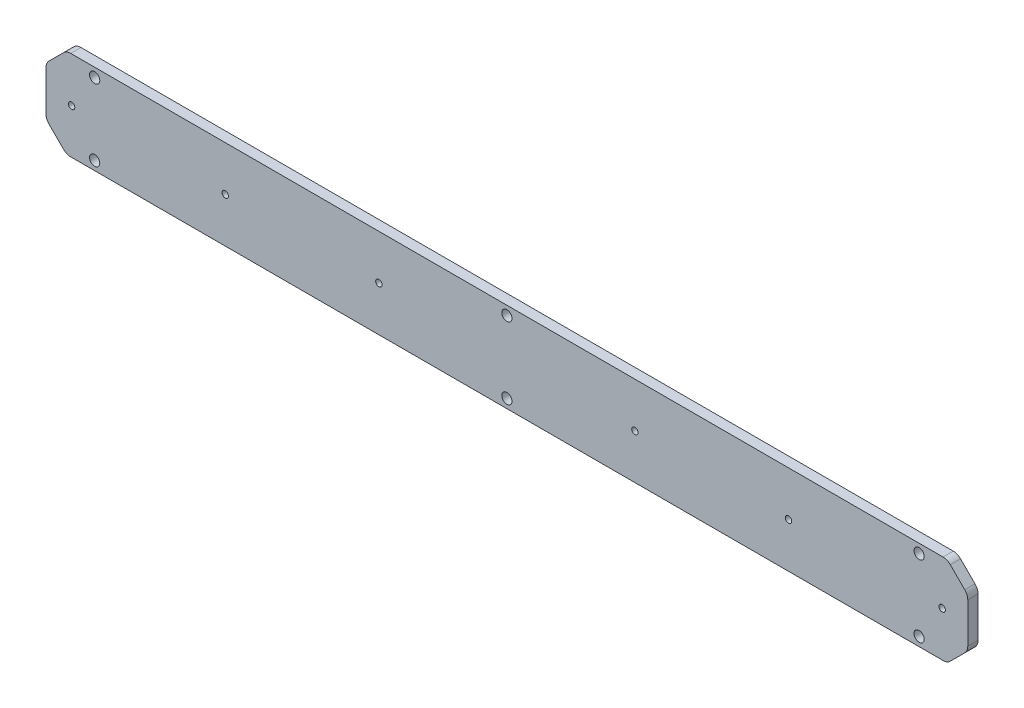
ISO-10303-21;
HEADER;
FILE_DESCRIPTION(('STEP AP214'),'2;1');
FILE_NAME('part.step','',(''),(''),'','','');
FILE_SCHEMA(('AUTOMOTIVE_DESIGN { 1 0 10303 214 1 1 1 1 }'));
ENDSEC;
DATA;
#1=APPLICATION_CONTEXT('core data for automotive mechanical design processes');
#2=APPLICATION_PROTOCOL_DEFINITION('international standard','automotive_design',2000,#1);
#3=PRODUCT_CONTEXT('',#1,'mechanical');
#4=PRODUCT('Part','Part','',(#3));
#5=PRODUCT_RELATED_PRODUCT_CATEGORY('part','',(#4));
#6=PRODUCT_DEFINITION_FORMATION('','',#4);
#7=PRODUCT_DEFINITION_CONTEXT('part definition',#1,'design');
#8=PRODUCT_DEFINITION('design','',#6,#7);
#9=PRODUCT_DEFINITION_SHAPE('','',#8);
#10=(LENGTH_UNIT() NAMED_UNIT(*) SI_UNIT(.MILLI.,.METRE.));
#11=(NAMED_UNIT(*) PLANE_ANGLE_UNIT() SI_UNIT($,.RADIAN.));
#12=(NAMED_UNIT(*) SI_UNIT($,.STERADIAN.) SOLID_ANGLE_UNIT());
#13=UNCERTAINTY_MEASURE_WITH_UNIT(LENGTH_MEASURE(1.E-05),#10,'distance_accuracy_value','');
#14=(GEOMETRIC_REPRESENTATION_CONTEXT(3) GLOBAL_UNCERTAINTY_ASSIGNED_CONTEXT((#13)) GLOBAL_UNIT_ASSIGNED_CONTEXT((#10,
#11,#12)) REPRESENTATION_CONTEXT('',''));
#15=CARTESIAN_POINT('',(0.,0.,0.));
#16=DIRECTION('',(0.,0.,1.));
#17=DIRECTION('',(1.,0.,0.));
#18=AXIS2_PLACEMENT_3D('',#15,#16,#17);
#19=CARTESIAN_POINT('',(180.,-17.5,4.));
#20=DIRECTION('',(-1.,0.,0.));
#21=DIRECTION('',(0.,0.,1.));
#22=AXIS2_PLACEMENT_3D('',#19,#20,#21);
#23=PLANE('',#22);
#24=DIRECTION('',(0.,1.,0.));
#25=VECTOR('',#24,1.);
#26=CARTESIAN_POINT('',(180.,-17.5,4.));
#27=LINE('',#26,#25);
#28=CARTESIAN_POINT('',(180.,-7.84314575050758,4.));
#29=VERTEX_POINT('',#28);
#30=CARTESIAN_POINT('',(180.,7.84314575050757,4.));
#31=VERTEX_POINT('',#30);
#32=EDGE_CURVE('E180',#29,#31,#27,.T.);
#33=ORIENTED_EDGE('',*,*,#32,.F.);
#34=DIRECTION('',(0.,0.,1.));
#35=VECTOR('',#34,1.);
#36=CARTESIAN_POINT('',(180.,-7.84314575050758,0.));
#37=LINE('',#36,#35);
#38=CARTESIAN_POINT('',(180.,-7.84314575050758,0.));
#39=VERTEX_POINT('',#38);
#40=EDGE_CURVE('E287',#29,#39,#37,.F.);
#41=ORIENTED_EDGE('',*,*,#40,.T.);
#42=DIRECTION('',(0.,1.,0.));
#43=VECTOR('',#42,1.);
#44=CARTESIAN_POINT('',(180.,-17.5,0.));
#45=LINE('',#44,#43);
#46=CARTESIAN_POINT('',(180.,7.84314575050757,0.));
#47=VERTEX_POINT('',#46);
#48=EDGE_CURVE('E194',#39,#47,#45,.T.);
#49=ORIENTED_EDGE('',*,*,#48,.T.);
#50=DIRECTION('',(0.,0.,-1.));
#51=VECTOR('',#50,1.);
#52=CARTESIAN_POINT('',(180.,7.84314575050757,4.));
#53=LINE('',#52,#51);
#54=EDGE_CURVE('E284',#47,#31,#53,.F.);
#55=ORIENTED_EDGE('',*,*,#54,.T.);
#56=EDGE_LOOP('',(#33,#41,#49,#55));
#57=FACE_BOUND('',#56,.T.);
#58=ADVANCED_FACE('F36',(#57),#23,.F.);
#59=CARTESIAN_POINT('',(-180.,17.5,4.));
#60=DIRECTION('',(0.,-1.,0.));
#61=DIRECTION('',(0.,0.,-1.));
#62=AXIS2_PLACEMENT_3D('',#59,#60,#61);
#63=PLANE('',#62);
#64=DIRECTION('',(-1.,0.,0.));
#65=VECTOR('',#64,1.);
#66=CARTESIAN_POINT('',(-180.,17.5,0.));
#67=LINE('',#66,#65);
#68=CARTESIAN_POINT('',(170.343145750507,17.5,0.));
#69=VERTEX_POINT('',#68);
#70=CARTESIAN_POINT('',(-170.343145750508,17.5,0.));
#71=VERTEX_POINT('',#70);
#72=EDGE_CURVE('E187',#69,#71,#67,.T.);
#73=ORIENTED_EDGE('',*,*,#72,.T.);
#74=DIRECTION('',(0.,0.,-1.));
#75=VECTOR('',#74,1.);
#76=CARTESIAN_POINT('',(-170.343145750508,17.5,4.));
#77=LINE('',#76,#75);
#78=CARTESIAN_POINT('',(-170.343145750508,17.5,4.));
#79=VERTEX_POINT('',#78);
#80=EDGE_CURVE('E277',#71,#79,#77,.F.);
#81=ORIENTED_EDGE('',*,*,#80,.T.);
#82=DIRECTION('',(-1.,0.,0.));
#83=VECTOR('',#82,1.);
#84=CARTESIAN_POINT('',(-180.,17.5,4.));
#85=LINE('',#84,#83);
#86=CARTESIAN_POINT('',(170.343145750507,17.5,4.));
#87=VERTEX_POINT('',#86);
#88=EDGE_CURVE('E184',#87,#79,#85,.T.);
#89=ORIENTED_EDGE('',*,*,#88,.F.);
#90=DIRECTION('',(0.,0.,1.));
#91=VECTOR('',#90,1.);
#92=CARTESIAN_POINT('',(170.343145750508,17.5,0.));
#93=LINE('',#92,#91);
#94=EDGE_CURVE('E274',#87,#69,#93,.F.);
#95=ORIENTED_EDGE('',*,*,#94,.T.);
#96=EDGE_LOOP('',(#73,#81,#89,#95));
#97=FACE_BOUND('',#96,.T.);
#98=ADVANCED_FACE('F304',(#97),#63,.F.);
#99=CARTESIAN_POINT('',(-180.,-17.5,4.));
#100=DIRECTION('',(1.,0.,0.));
#101=DIRECTION('',(0.,0.,-1.));
#102=AXIS2_PLACEMENT_3D('',#99,#100,#101);
#103=PLANE('',#102);
#104=DIRECTION('',(0.,-1.,0.));
#105=VECTOR('',#104,1.);
#106=CARTESIAN_POINT('',(-180.,-17.5,0.));
#107=LINE('',#106,#105);
#108=CARTESIAN_POINT('',(-180.,7.84314575050757,0.));
#109=VERTEX_POINT('',#108);
#110=CARTESIAN_POINT('',(-180.,-7.84314575050758,0.));
#111=VERTEX_POINT('',#110);
#112=EDGE_CURVE('E181',#109,#111,#107,.T.);
#113=ORIENTED_EDGE('',*,*,#112,.T.);
#114=DIRECTION('',(0.,0.,-1.));
#115=VECTOR('',#114,1.);
#116=CARTESIAN_POINT('',(-180.,-7.84314575050758,4.));
#117=LINE('',#116,#115);
#118=CARTESIAN_POINT('',(-180.,-7.84314575050758,4.));
#119=VERTEX_POINT('',#118);
#120=EDGE_CURVE('E268',#111,#119,#117,.F.);
#121=ORIENTED_EDGE('',*,*,#120,.T.);
#122=DIRECTION('',(0.,-1.,0.));
#123=VECTOR('',#122,1.);
#124=CARTESIAN_POINT('',(-180.,-17.5,4.));
#125=LINE('',#124,#123);
#126=CARTESIAN_POINT('',(-180.,7.84314575050757,4.));
#127=VERTEX_POINT('',#126);
#128=EDGE_CURVE('E311',#127,#119,#125,.T.);
#129=ORIENTED_EDGE('',*,*,#128,.F.);
#130=DIRECTION('',(0.,0.,1.));
#131=VECTOR('',#130,1.);
#132=CARTESIAN_POINT('',(-180.,7.84314575050757,0.));
#133=LINE('',#132,#131);
#134=EDGE_CURVE('E265',#127,#109,#133,.F.);
#135=ORIENTED_EDGE('',*,*,#134,.T.);
#136=EDGE_LOOP('',(#113,#121,#129,#135));
#137=FACE_BOUND('',#136,.T.);
#138=ADVANCED_FACE('F410',(#137),#103,.F.);
#139=CARTESIAN_POINT('',(-180.,-17.5,4.));
#140=DIRECTION('',(0.,1.,0.));
#141=DIRECTION('',(0.,0.,1.));
#142=AXIS2_PLACEMENT_3D('',#139,#140,#141);
#143=PLANE('',#142);
#144=DIRECTION('',(1.,0.,0.));
#145=VECTOR('',#144,1.);
#146=CARTESIAN_POINT('',(-180.,-17.5,4.));
#147=LINE('',#146,#145);
#148=CARTESIAN_POINT('',(-170.343145750508,-17.5,4.));
#149=VERTEX_POINT('',#148);
#150=CARTESIAN_POINT('',(170.343145750507,-17.5,4.));
#151=VERTEX_POINT('',#150);
#152=EDGE_CURVE('E172',#149,#151,#147,.T.);
#153=ORIENTED_EDGE('',*,*,#152,.F.);
#154=DIRECTION('',(0.,0.,1.));
#155=VECTOR('',#154,1.);
#156=CARTESIAN_POINT('',(-170.343145750508,-17.5,0.));
#157=LINE('',#156,#155);
#158=CARTESIAN_POINT('',(-170.343145750508,-17.5,0.));
#159=VERTEX_POINT('',#158);
#160=EDGE_CURVE('E155',#149,#159,#157,.F.);
#161=ORIENTED_EDGE('',*,*,#160,.T.);
#162=DIRECTION('',(1.,0.,0.));
#163=VECTOR('',#162,1.);
#164=CARTESIAN_POINT('',(-180.,-17.5,0.));
#165=LINE('',#164,#163);
#166=CARTESIAN_POINT('',(170.343145750507,-17.5,0.));
#167=VERTEX_POINT('',#166);
#168=EDGE_CURVE('E169',#159,#167,#165,.T.);
#169=ORIENTED_EDGE('',*,*,#168,.T.);
#170=DIRECTION('',(0.,0.,-1.));
#171=VECTOR('',#170,1.);
#172=CARTESIAN_POINT('',(170.343145750508,-17.5,4.));
#173=LINE('',#172,#171);
#174=EDGE_CURVE('E174',#167,#151,#173,.F.);
#175=ORIENTED_EDGE('',*,*,#174,.T.);
#176=EDGE_LOOP('',(#153,#161,#169,#175));
#177=FACE_BOUND('',#176,.T.);
#178=ADVANCED_FACE('F167',(#177),#143,.F.);
#179=CARTESIAN_POINT('',(0.,0.,4.));
#180=DIRECTION('',(0.,0.,-1.));
#181=DIRECTION('',(-1.,0.,0.));
#182=AXIS2_PLACEMENT_3D('',#179,#180,#181);
#183=PLANE('',#182);
#184=CARTESIAN_POINT('',(-170.,0.,4.));
#185=DIRECTION('',(0.,0.,1.));
#186=DIRECTION('',(1.,0.,0.));
#187=AXIS2_PLACEMENT_3D('',#184,#185,#186);
#188=CIRCLE('',#187,1.25);
#189=CARTESIAN_POINT('',(-168.75,0.,4.));
#190=VERTEX_POINT('',#189);
#191=EDGE_CURVE('E359',#190,#190,#188,.T.);
#192=ORIENTED_EDGE('',*,*,#191,.F.);
#193=EDGE_LOOP('',(#192));
#194=FACE_BOUND('',#193,.T.);
#195=CARTESIAN_POINT('',(-110.,0.,4.));
#196=DIRECTION('',(0.,0.,1.));
#197=DIRECTION('',(1.,0.,0.));
#198=AXIS2_PLACEMENT_3D('',#195,#196,#197);
#199=CIRCLE('',#198,1.25);
#200=CARTESIAN_POINT('',(-108.75,0.,4.));
#201=VERTEX_POINT('',#200);
#202=EDGE_CURVE('E353',#201,#201,#199,.T.);
#203=ORIENTED_EDGE('',*,*,#202,.F.);
#204=EDGE_LOOP('',(#203));
#205=FACE_BOUND('',#204,.T.);
#206=CARTESIAN_POINT('',(-50.,0.,4.));
#207=DIRECTION('',(0.,0.,1.));
#208=DIRECTION('',(1.,0.,0.));
#209=AXIS2_PLACEMENT_3D('',#206,#207,#208);
#210=CIRCLE('',#209,1.25);
#211=CARTESIAN_POINT('',(-48.75,0.,4.));
#212=VERTEX_POINT('',#211);
#213=EDGE_CURVE('E347',#212,#212,#210,.T.);
#214=ORIENTED_EDGE('',*,*,#213,.F.);
#215=EDGE_LOOP('',(#214));
#216=FACE_BOUND('',#215,.T.);
#217=CARTESIAN_POINT('',(50.,0.,4.));
#218=DIRECTION('',(0.,0.,1.));
#219=DIRECTION('',(1.,0.,0.));
#220=AXIS2_PLACEMENT_3D('',#217,#218,#219);
#221=CIRCLE('',#220,1.25);
#222=CARTESIAN_POINT('',(51.25,0.,4.));
#223=VERTEX_POINT('',#222);
#224=EDGE_CURVE('E341',#223,#223,#221,.T.);
#225=ORIENTED_EDGE('',*,*,#224,.F.);
#226=EDGE_LOOP('',(#225));
#227=FACE_BOUND('',#226,.T.);
#228=CARTESIAN_POINT('',(110.,0.,4.));
#229=DIRECTION('',(0.,0.,1.));
#230=DIRECTION('',(1.,0.,0.));
#231=AXIS2_PLACEMENT_3D('',#228,#229,#230);
#232=CIRCLE('',#231,1.25);
#233=CARTESIAN_POINT('',(111.25,0.,4.));
#234=VERTEX_POINT('',#233);
#235=EDGE_CURVE('E335',#234,#234,#232,.T.);
#236=ORIENTED_EDGE('',*,*,#235,.F.);
#237=EDGE_LOOP('',(#236));
#238=FACE_BOUND('',#237,.T.);
#239=CARTESIAN_POINT('',(170.,0.,4.));
#240=DIRECTION('',(0.,0.,1.));
#241=DIRECTION('',(1.,0.,0.));
#242=AXIS2_PLACEMENT_3D('',#239,#240,#241);
#243=CIRCLE('',#242,1.25);
#244=CARTESIAN_POINT('',(171.25,0.,4.));
#245=VERTEX_POINT('',#244);
#246=EDGE_CURVE('E329',#245,#245,#243,.T.);
#247=ORIENTED_EDGE('',*,*,#246,.F.);
#248=EDGE_LOOP('',(#247));
#249=FACE_BOUND('',#248,.T.);
#250=CARTESIAN_POINT('',(-161.,-14.,4.));
#251=DIRECTION('',(0.,0.,1.));
#252=DIRECTION('',(1.,0.,0.));
#253=AXIS2_PLACEMENT_3D('',#250,#251,#252);
#254=CIRCLE('',#253,2.);
#255=CARTESIAN_POINT('',(-159.,-14.,4.));
#256=VERTEX_POINT('',#255);
#257=EDGE_CURVE('E215',#256,#256,#254,.T.);
#258=ORIENTED_EDGE('',*,*,#257,.F.);
#259=EDGE_LOOP('',(#258));
#260=FACE_BOUND('',#259,.T.);
#261=CARTESIAN_POINT('',(-161.,14.,4.));
#262=DIRECTION('',(0.,0.,1.));
#263=DIRECTION('',(1.,0.,0.));
#264=AXIS2_PLACEMENT_3D('',#261,#262,#263);
#265=CIRCLE('',#264,2.);
#266=CARTESIAN_POINT('',(-159.,14.,4.));
#267=VERTEX_POINT('',#266);
#268=EDGE_CURVE('E211',#267,#267,#265,.T.);
#269=ORIENTED_EDGE('',*,*,#268,.F.);
#270=EDGE_LOOP('',(#269));
#271=FACE_BOUND('',#270,.T.);
#272=CARTESIAN_POINT('',(161.,-14.,4.));
#273=DIRECTION('',(0.,0.,1.));
#274=DIRECTION('',(1.,0.,0.));
#275=AXIS2_PLACEMENT_3D('',#272,#273,#274);
#276=CIRCLE('',#275,2.);
#277=CARTESIAN_POINT('',(163.,-14.,4.));
#278=VERTEX_POINT('',#277);
#279=EDGE_CURVE('E207',#278,#278,#276,.T.);
#280=ORIENTED_EDGE('',*,*,#279,.F.);
#281=EDGE_LOOP('',(#280));
#282=FACE_BOUND('',#281,.T.);
#283=CARTESIAN_POINT('',(161.,14.,4.));
#284=DIRECTION('',(0.,0.,1.));
#285=DIRECTION('',(1.,0.,0.));
#286=AXIS2_PLACEMENT_3D('',#283,#284,#285);
#287=CIRCLE('',#286,2.);
#288=CARTESIAN_POINT('',(163.,14.,4.));
#289=VERTEX_POINT('',#288);
#290=EDGE_CURVE('E203',#289,#289,#287,.T.);
#291=ORIENTED_EDGE('',*,*,#290,.F.);
#292=EDGE_LOOP('',(#291));
#293=FACE_BOUND('',#292,.T.);
#294=CARTESIAN_POINT('',(0.,-14.,4.));
#295=DIRECTION('',(0.,0.,1.));
#296=DIRECTION('',(1.,0.,0.));
#297=AXIS2_PLACEMENT_3D('',#294,#295,#296);
#298=CIRCLE('',#297,2.);
#299=CARTESIAN_POINT('',(2.,-14.,4.));
#300=VERTEX_POINT('',#299);
#301=EDGE_CURVE('E199',#300,#300,#298,.T.);
#302=ORIENTED_EDGE('',*,*,#301,.F.);
#303=EDGE_LOOP('',(#302));
#304=FACE_BOUND('',#303,.T.);
#305=CARTESIAN_POINT('',(0.,14.,4.));
#306=DIRECTION('',(0.,0.,1.));
#307=DIRECTION('',(1.,0.,0.));
#308=AXIS2_PLACEMENT_3D('',#305,#306,#307);
#309=CIRCLE('',#308,2.);
#310=CARTESIAN_POINT('',(2.,14.,4.));
#311=VERTEX_POINT('',#310);
#312=EDGE_CURVE('E195',#311,#311,#309,.T.);
#313=ORIENTED_EDGE('',*,*,#312,.F.);
#314=EDGE_LOOP('',(#313));
#315=FACE_BOUND('',#314,.T.);
#316=DIRECTION('',(-0.707106781186548,0.707106781186548,0.));
#317=VECTOR('',#316,1.);
#318=CARTESIAN_POINT('',(-172.,-17.5,4.));
#319=LINE('',#318,#317);
#320=CARTESIAN_POINT('',(-178.828427124746,-10.6715728752538,4.));
#321=VERTEX_POINT('',#320);
#322=CARTESIAN_POINT('',(-173.171572875254,-16.3284271247462,4.));
#323=VERTEX_POINT('',#322);
#324=EDGE_CURVE('E228',#321,#323,#319,.F.);
#325=ORIENTED_EDGE('',*,*,#324,.T.);
#326=CARTESIAN_POINT('',(-170.343145750508,-13.5,4.));
#327=DIRECTION('',(0.,0.,-1.));
#328=DIRECTION('',(-1.,0.,0.));
#329=AXIS2_PLACEMENT_3D('',#326,#327,#328);
#330=CIRCLE('',#329,4.);
#331=EDGE_CURVE('E263',#323,#149,#330,.F.);
#332=ORIENTED_EDGE('',*,*,#331,.T.);
#333=ORIENTED_EDGE('',*,*,#152,.T.);
#334=CARTESIAN_POINT('',(170.343145750508,-13.5,4.));
#335=DIRECTION('',(0.,0.,-1.));
#336=DIRECTION('',(-1.,0.,0.));
#337=AXIS2_PLACEMENT_3D('',#334,#335,#336);
#338=CIRCLE('',#337,4.);
#339=CARTESIAN_POINT('',(173.171572875254,-16.3284271247462,4.));
#340=VERTEX_POINT('',#339);
#341=EDGE_CURVE('E257',#151,#340,#338,.F.);
#342=ORIENTED_EDGE('',*,*,#341,.T.);
#343=DIRECTION('',(-0.707106781186548,-0.707106781186548,0.));
#344=VECTOR('',#343,1.);
#345=CARTESIAN_POINT('',(180.,-9.49999999999994,4.));
#346=LINE('',#345,#344);
#347=CARTESIAN_POINT('',(178.828427124746,-10.6715728752538,4.));
#348=VERTEX_POINT('',#347);
#349=EDGE_CURVE('E234',#340,#348,#346,.F.);
#350=ORIENTED_EDGE('',*,*,#349,.T.);
#351=CARTESIAN_POINT('',(176.,-7.84314575050758,4.));
#352=DIRECTION('',(0.,0.,-1.));
#353=DIRECTION('',(-1.,0.,0.));
#354=AXIS2_PLACEMENT_3D('',#351,#352,#353);
#355=CIRCLE('',#354,4.);
#356=EDGE_CURVE('E255',#348,#29,#355,.F.);
#357=ORIENTED_EDGE('',*,*,#356,.T.);
#358=ORIENTED_EDGE('',*,*,#32,.T.);
#359=CARTESIAN_POINT('',(176.,7.84314575050757,4.));
#360=DIRECTION('',(0.,0.,-1.));
#361=DIRECTION('',(-1.,0.,0.));
#362=AXIS2_PLACEMENT_3D('',#359,#360,#361);
#363=CIRCLE('',#362,4.);
#364=CARTESIAN_POINT('',(178.828427124746,10.6715728752538,4.));
#365=VERTEX_POINT('',#364);
#366=EDGE_CURVE('E253',#31,#365,#363,.F.);
#367=ORIENTED_EDGE('',*,*,#366,.T.);
#368=DIRECTION('',(0.707106781186548,-0.707106781186548,0.));
#369=VECTOR('',#368,1.);
#370=CARTESIAN_POINT('',(172.,17.5,4.));
#371=LINE('',#370,#369);
#372=CARTESIAN_POINT('',(173.171572875254,16.3284271247462,4.));
#373=VERTEX_POINT('',#372);
#374=EDGE_CURVE('E231',#365,#373,#371,.F.);
#375=ORIENTED_EDGE('',*,*,#374,.T.);
#376=CARTESIAN_POINT('',(170.343145750508,13.5,4.));
#377=DIRECTION('',(0.,0.,-1.));
#378=DIRECTION('',(-1.,0.,0.));
#379=AXIS2_PLACEMENT_3D('',#376,#377,#378);
#380=CIRCLE('',#379,4.);
#381=EDGE_CURVE('E251',#373,#87,#380,.F.);
#382=ORIENTED_EDGE('',*,*,#381,.T.);
#383=ORIENTED_EDGE('',*,*,#88,.T.);
#384=CARTESIAN_POINT('',(-170.343145750508,13.5,4.));
#385=DIRECTION('',(0.,0.,-1.));
#386=DIRECTION('',(-1.,0.,0.));
#387=AXIS2_PLACEMENT_3D('',#384,#385,#386);
#388=CIRCLE('',#387,4.);
#389=CARTESIAN_POINT('',(-173.171572875254,16.3284271247462,4.));
#390=VERTEX_POINT('',#389);
#391=EDGE_CURVE('E259',#79,#390,#388,.F.);
#392=ORIENTED_EDGE('',*,*,#391,.T.);
#393=DIRECTION('',(0.707106781186548,0.707106781186548,0.));
#394=VECTOR('',#393,1.);
#395=CARTESIAN_POINT('',(-180.,9.49999999999994,4.));
#396=LINE('',#395,#394);
#397=CARTESIAN_POINT('',(-178.828427124746,10.6715728752538,4.));
#398=VERTEX_POINT('',#397);
#399=EDGE_CURVE('E226',#390,#398,#396,.F.);
#400=ORIENTED_EDGE('',*,*,#399,.T.);
#401=CARTESIAN_POINT('',(-176.,7.84314575050757,4.));
#402=DIRECTION('',(0.,0.,-1.));
#403=DIRECTION('',(-1.,0.,0.));
#404=AXIS2_PLACEMENT_3D('',#401,#402,#403);
#405=CIRCLE('',#404,4.);
#406=EDGE_CURVE('E59',#398,#127,#405,.F.);
#407=ORIENTED_EDGE('',*,*,#406,.T.);
#408=ORIENTED_EDGE('',*,*,#128,.T.);
#409=CARTESIAN_POINT('',(-176.,-7.84314575050758,4.));
#410=DIRECTION('',(0.,0.,-1.));
#411=DIRECTION('',(-1.,0.,0.));
#412=AXIS2_PLACEMENT_3D('',#409,#410,#411);
#413=CIRCLE('',#412,4.);
#414=EDGE_CURVE('E51',#119,#321,#413,.F.);
#415=ORIENTED_EDGE('',*,*,#414,.T.);
#416=EDGE_LOOP('',(#325,#332,#333,#342,#350,#357,#358,#367,#375,#382,#383,#392,#400,#407,#408,#415));
#417=FACE_BOUND('',#416,.T.);
#418=ADVANCED_FACE('F297',(#194,#205,#216,#227,#238,#249,#260,#271,#282,#293,#304,#315,#417),
#183,.F.);
#419=CARTESIAN_POINT('',(0.,0.,0.));
#420=DIRECTION('',(0.,0.,-1.));
#421=DIRECTION('',(-1.,0.,0.));
#422=AXIS2_PLACEMENT_3D('',#419,#420,#421);
#423=PLANE('',#422);
#424=CARTESIAN_POINT('',(-170.,0.,0.));
#425=DIRECTION('',(0.,0.,1.));
#426=DIRECTION('',(1.,0.,0.));
#427=AXIS2_PLACEMENT_3D('',#424,#425,#426);
#428=CIRCLE('',#427,1.25);
#429=CARTESIAN_POINT('',(-168.75,0.,0.));
#430=VERTEX_POINT('',#429);
#431=EDGE_CURVE('E356',#430,#430,#428,.T.);
#432=ORIENTED_EDGE('',*,*,#431,.T.);
#433=EDGE_LOOP('',(#432));
#434=FACE_BOUND('',#433,.T.);
#435=CARTESIAN_POINT('',(-110.,0.,0.));
#436=DIRECTION('',(0.,0.,1.));
#437=DIRECTION('',(1.,0.,0.));
#438=AXIS2_PLACEMENT_3D('',#435,#436,#437);
#439=CIRCLE('',#438,1.25);
#440=CARTESIAN_POINT('',(-108.75,0.,0.));
#441=VERTEX_POINT('',#440);
#442=EDGE_CURVE('E350',#441,#441,#439,.T.);
#443=ORIENTED_EDGE('',*,*,#442,.T.);
#444=EDGE_LOOP('',(#443));
#445=FACE_BOUND('',#444,.T.);
#446=CARTESIAN_POINT('',(-50.,0.,0.));
#447=DIRECTION('',(0.,0.,1.));
#448=DIRECTION('',(1.,0.,0.));
#449=AXIS2_PLACEMENT_3D('',#446,#447,#448);
#450=CIRCLE('',#449,1.25);
#451=CARTESIAN_POINT('',(-48.75,0.,0.));
#452=VERTEX_POINT('',#451);
#453=EDGE_CURVE('E344',#452,#452,#450,.T.);
#454=ORIENTED_EDGE('',*,*,#453,.T.);
#455=EDGE_LOOP('',(#454));
#456=FACE_BOUND('',#455,.T.);
#457=CARTESIAN_POINT('',(50.,0.,0.));
#458=DIRECTION('',(0.,0.,1.));
#459=DIRECTION('',(1.,0.,0.));
#460=AXIS2_PLACEMENT_3D('',#457,#458,#459);
#461=CIRCLE('',#460,1.25);
#462=CARTESIAN_POINT('',(51.25,0.,0.));
#463=VERTEX_POINT('',#462);
#464=EDGE_CURVE('E338',#463,#463,#461,.T.);
#465=ORIENTED_EDGE('',*,*,#464,.T.);
#466=EDGE_LOOP('',(#465));
#467=FACE_BOUND('',#466,.T.);
#468=CARTESIAN_POINT('',(110.,0.,0.));
#469=DIRECTION('',(0.,0.,1.));
#470=DIRECTION('',(1.,0.,0.));
#471=AXIS2_PLACEMENT_3D('',#468,#469,#470);
#472=CIRCLE('',#471,1.25);
#473=CARTESIAN_POINT('',(111.25,0.,0.));
#474=VERTEX_POINT('',#473);
#475=EDGE_CURVE('E332',#474,#474,#472,.T.);
#476=ORIENTED_EDGE('',*,*,#475,.T.);
#477=EDGE_LOOP('',(#476));
#478=FACE_BOUND('',#477,.T.);
#479=CARTESIAN_POINT('',(170.,0.,0.));
#480=DIRECTION('',(0.,0.,1.));
#481=DIRECTION('',(1.,0.,0.));
#482=AXIS2_PLACEMENT_3D('',#479,#480,#481);
#483=CIRCLE('',#482,1.25);
#484=CARTESIAN_POINT('',(171.25,0.,0.));
#485=VERTEX_POINT('',#484);
#486=EDGE_CURVE('E326',#485,#485,#483,.T.);
#487=ORIENTED_EDGE('',*,*,#486,.T.);
#488=EDGE_LOOP('',(#487));
#489=FACE_BOUND('',#488,.T.);
#490=CARTESIAN_POINT('',(-161.,-14.,0.));
#491=DIRECTION('',(0.,0.,-1.));
#492=DIRECTION('',(-1.,0.,0.));
#493=AXIS2_PLACEMENT_3D('',#490,#491,#492);
#494=CIRCLE('',#493,2.);
#495=CARTESIAN_POINT('',(-163.,-14.,0.));
#496=VERTEX_POINT('',#495);
#497=EDGE_CURVE('E212',#496,#496,#494,.T.);
#498=ORIENTED_EDGE('',*,*,#497,.F.);
#499=EDGE_LOOP('',(#498));
#500=FACE_BOUND('',#499,.T.);
#501=CARTESIAN_POINT('',(-161.,14.,0.));
#502=DIRECTION('',(0.,0.,-1.));
#503=DIRECTION('',(-1.,0.,0.));
#504=AXIS2_PLACEMENT_3D('',#501,#502,#503);
#505=CIRCLE('',#504,2.);
#506=CARTESIAN_POINT('',(-163.,14.,0.));
#507=VERTEX_POINT('',#506);
#508=EDGE_CURVE('E208',#507,#507,#505,.T.);
#509=ORIENTED_EDGE('',*,*,#508,.F.);
#510=EDGE_LOOP('',(#509));
#511=FACE_BOUND('',#510,.T.);
#512=CARTESIAN_POINT('',(161.,-14.,0.));
#513=DIRECTION('',(0.,0.,-1.));
#514=DIRECTION('',(-1.,0.,0.));
#515=AXIS2_PLACEMENT_3D('',#512,#513,#514);
#516=CIRCLE('',#515,2.);
#517=CARTESIAN_POINT('',(159.,-14.,0.));
#518=VERTEX_POINT('',#517);
#519=EDGE_CURVE('E204',#518,#518,#516,.T.);
#520=ORIENTED_EDGE('',*,*,#519,.F.);
#521=EDGE_LOOP('',(#520));
#522=FACE_BOUND('',#521,.T.);
#523=CARTESIAN_POINT('',(161.,14.,0.));
#524=DIRECTION('',(0.,0.,-1.));
#525=DIRECTION('',(-1.,0.,0.));
#526=AXIS2_PLACEMENT_3D('',#523,#524,#525);
#527=CIRCLE('',#526,2.);
#528=CARTESIAN_POINT('',(159.,14.,0.));
#529=VERTEX_POINT('',#528);
#530=EDGE_CURVE('E200',#529,#529,#527,.T.);
#531=ORIENTED_EDGE('',*,*,#530,.F.);
#532=EDGE_LOOP('',(#531));
#533=FACE_BOUND('',#532,.T.);
#534=CARTESIAN_POINT('',(0.,-14.,0.));
#535=DIRECTION('',(0.,0.,-1.));
#536=DIRECTION('',(-1.,0.,0.));
#537=AXIS2_PLACEMENT_3D('',#534,#535,#536);
#538=CIRCLE('',#537,2.);
#539=CARTESIAN_POINT('',(-2.,-14.,0.));
#540=VERTEX_POINT('',#539);
#541=EDGE_CURVE('E196',#540,#540,#538,.T.);
#542=ORIENTED_EDGE('',*,*,#541,.F.);
#543=EDGE_LOOP('',(#542));
#544=FACE_BOUND('',#543,.T.);
#545=CARTESIAN_POINT('',(0.,14.,0.));
#546=DIRECTION('',(0.,0.,-1.));
#547=DIRECTION('',(-1.,0.,0.));
#548=AXIS2_PLACEMENT_3D('',#545,#546,#547);
#549=CIRCLE('',#548,2.);
#550=CARTESIAN_POINT('',(-2.,14.,0.));
#551=VERTEX_POINT('',#550);
#552=EDGE_CURVE('E191',#551,#551,#549,.T.);
#553=ORIENTED_EDGE('',*,*,#552,.F.);
#554=EDGE_LOOP('',(#553));
#555=FACE_BOUND('',#554,.T.);
#556=ORIENTED_EDGE('',*,*,#168,.F.);
#557=CARTESIAN_POINT('',(-170.343145750508,-13.5,0.));
#558=DIRECTION('',(0.,0.,-1.));
#559=DIRECTION('',(-1.,0.,0.));
#560=AXIS2_PLACEMENT_3D('',#557,#558,#559);
#561=CIRCLE('',#560,4.);
#562=CARTESIAN_POINT('',(-173.171572875254,-16.3284271247462,0.));
#563=VERTEX_POINT('',#562);
#564=EDGE_CURVE('E151',#159,#563,#561,.T.);
#565=ORIENTED_EDGE('',*,*,#564,.T.);
#566=DIRECTION('',(0.707106781186548,-0.707106781186548,0.));
#567=VECTOR('',#566,1.);
#568=CARTESIAN_POINT('',(-94.75,-94.75,0.));
#569=LINE('',#568,#567);
#570=CARTESIAN_POINT('',(-178.828427124746,-10.6715728752538,0.));
#571=VERTEX_POINT('',#570);
#572=EDGE_CURVE('E219',#563,#571,#569,.F.);
#573=ORIENTED_EDGE('',*,*,#572,.T.);
#574=CARTESIAN_POINT('',(-176.,-7.84314575050758,0.));
#575=DIRECTION('',(0.,0.,-1.));
#576=DIRECTION('',(-1.,0.,0.));
#577=AXIS2_PLACEMENT_3D('',#574,#575,#576);
#578=CIRCLE('',#577,4.);
#579=EDGE_CURVE('E162',#571,#111,#578,.T.);
#580=ORIENTED_EDGE('',*,*,#579,.T.);
#581=ORIENTED_EDGE('',*,*,#112,.F.);
#582=CARTESIAN_POINT('',(-176.,7.84314575050757,0.));
#583=DIRECTION('',(0.,0.,-1.));
#584=DIRECTION('',(-1.,0.,0.));
#585=AXIS2_PLACEMENT_3D('',#582,#583,#584);
#586=CIRCLE('',#585,4.);
#587=CARTESIAN_POINT('',(-178.828427124746,10.6715728752538,0.));
#588=VERTEX_POINT('',#587);
#589=EDGE_CURVE('E246',#109,#588,#586,.T.);
#590=ORIENTED_EDGE('',*,*,#589,.T.);
#591=DIRECTION('',(-0.707106781186548,-0.707106781186548,0.));
#592=VECTOR('',#591,1.);
#593=CARTESIAN_POINT('',(-94.75,94.75,0.));
#594=LINE('',#593,#592);
#595=CARTESIAN_POINT('',(-173.171572875254,16.3284271247462,0.));
#596=VERTEX_POINT('',#595);
#597=EDGE_CURVE('E216',#588,#596,#594,.F.);
#598=ORIENTED_EDGE('',*,*,#597,.T.);
#599=CARTESIAN_POINT('',(-170.343145750508,13.5,0.));
#600=DIRECTION('',(0.,0.,-1.));
#601=DIRECTION('',(-1.,0.,0.));
#602=AXIS2_PLACEMENT_3D('',#599,#600,#601);
#603=CIRCLE('',#602,4.);
#604=EDGE_CURVE('E244',#596,#71,#603,.T.);
#605=ORIENTED_EDGE('',*,*,#604,.T.);
#606=ORIENTED_EDGE('',*,*,#72,.F.);
#607=CARTESIAN_POINT('',(170.343145750508,13.5,0.));
#608=DIRECTION('',(0.,0.,-1.));
#609=DIRECTION('',(-1.,0.,0.));
#610=AXIS2_PLACEMENT_3D('',#607,#608,#609);
#611=CIRCLE('',#610,4.);
#612=CARTESIAN_POINT('',(173.171572875254,16.3284271247462,0.));
#613=VERTEX_POINT('',#612);
#614=EDGE_CURVE('E173',#69,#613,#611,.T.);
#615=ORIENTED_EDGE('',*,*,#614,.T.);
#616=DIRECTION('',(-0.707106781186548,0.707106781186548,0.));
#617=VECTOR('',#616,1.);
#618=CARTESIAN_POINT('',(94.75,94.75,0.));
#619=LINE('',#618,#617);
#620=CARTESIAN_POINT('',(178.828427124746,10.6715728752538,0.));
#621=VERTEX_POINT('',#620);
#622=EDGE_CURVE('E221',#613,#621,#619,.F.);
#623=ORIENTED_EDGE('',*,*,#622,.T.);
#624=CARTESIAN_POINT('',(176.,7.84314575050757,0.));
#625=DIRECTION('',(0.,0.,-1.));
#626=DIRECTION('',(-1.,0.,0.));
#627=AXIS2_PLACEMENT_3D('',#624,#625,#626);
#628=CIRCLE('',#627,4.);
#629=EDGE_CURVE('E239',#621,#47,#628,.T.);
#630=ORIENTED_EDGE('',*,*,#629,.T.);
#631=ORIENTED_EDGE('',*,*,#48,.F.);
#632=CARTESIAN_POINT('',(176.,-7.84314575050758,0.));
#633=DIRECTION('',(0.,0.,-1.));
#634=DIRECTION('',(-1.,0.,0.));
#635=AXIS2_PLACEMENT_3D('',#632,#633,#634);
#636=CIRCLE('',#635,4.);
#637=CARTESIAN_POINT('',(178.828427124746,-10.6715728752538,0.));
#638=VERTEX_POINT('',#637);
#639=EDGE_CURVE('E241',#39,#638,#636,.T.);
#640=ORIENTED_EDGE('',*,*,#639,.T.);
#641=DIRECTION('',(0.707106781186548,0.707106781186548,0.));
#642=VECTOR('',#641,1.);
#643=CARTESIAN_POINT('',(94.75,-94.75,0.));
#644=LINE('',#643,#642);
#645=CARTESIAN_POINT('',(173.171572875254,-16.3284271247462,0.));
#646=VERTEX_POINT('',#645);
#647=EDGE_CURVE('E224',#638,#646,#644,.F.);
#648=ORIENTED_EDGE('',*,*,#647,.T.);
#649=CARTESIAN_POINT('',(170.343145750508,-13.5,0.));
#650=DIRECTION('',(0.,0.,-1.));
#651=DIRECTION('',(-1.,0.,0.));
#652=AXIS2_PLACEMENT_3D('',#649,#650,#651);
#653=CIRCLE('',#652,4.);
#654=EDGE_CURVE('E179',#646,#167,#653,.T.);
#655=ORIENTED_EDGE('',*,*,#654,.T.);
#656=EDGE_LOOP('',(#556,#565,#573,#580,#581,#590,#598,#605,#606,#615,#623,#630,#631,#640,#648,#655));
#657=FACE_BOUND('',#656,.T.);
#658=ADVANCED_FACE('F176',(#434,#445,#456,#467,#478,#489,#500,#511,#522,#533,#544,#555,#657),
#423,.T.);
#659=CARTESIAN_POINT('',(0.,14.,-1.));
#660=DIRECTION('',(0.,0.,1.));
#661=DIRECTION('',(1.,0.,0.));
#662=AXIS2_PLACEMENT_3D('',#659,#660,#661);
#663=CYLINDRICAL_SURFACE('',#662,2.);
#664=ORIENTED_EDGE('',*,*,#552,.T.);
#665=EDGE_LOOP('',(#664));
#666=FACE_BOUND('',#665,.T.);
#667=ORIENTED_EDGE('',*,*,#312,.T.);
#668=EDGE_LOOP('',(#667));
#669=FACE_BOUND('',#668,.T.);
#670=ADVANCED_FACE('F390',(#666,#669),#663,.F.);
#671=CARTESIAN_POINT('',(0.,-14.,-1.));
#672=DIRECTION('',(0.,0.,1.));
#673=DIRECTION('',(1.,0.,0.));
#674=AXIS2_PLACEMENT_3D('',#671,#672,#673);
#675=CYLINDRICAL_SURFACE('',#674,2.);
#676=ORIENTED_EDGE('',*,*,#541,.T.);
#677=EDGE_LOOP('',(#676));
#678=FACE_BOUND('',#677,.T.);
#679=ORIENTED_EDGE('',*,*,#301,.T.);
#680=EDGE_LOOP('',(#679));
#681=FACE_BOUND('',#680,.T.);
#682=ADVANCED_FACE('F392',(#678,#681),#675,.F.);
#683=CARTESIAN_POINT('',(161.,14.,-1.));
#684=DIRECTION('',(0.,0.,1.));
#685=DIRECTION('',(1.,0.,0.));
#686=AXIS2_PLACEMENT_3D('',#683,#684,#685);
#687=CYLINDRICAL_SURFACE('',#686,2.);
#688=ORIENTED_EDGE('',*,*,#530,.T.);
#689=EDGE_LOOP('',(#688));
#690=FACE_BOUND('',#689,.T.);
#691=ORIENTED_EDGE('',*,*,#290,.T.);
#692=EDGE_LOOP('',(#691));
#693=FACE_BOUND('',#692,.T.);
#694=ADVANCED_FACE('F399',(#690,#693),#687,.F.);
#695=CARTESIAN_POINT('',(161.,-14.,-1.));
#696=DIRECTION('',(0.,0.,1.));
#697=DIRECTION('',(1.,0.,0.));
#698=AXIS2_PLACEMENT_3D('',#695,#696,#697);
#699=CYLINDRICAL_SURFACE('',#698,2.);
#700=ORIENTED_EDGE('',*,*,#519,.T.);
#701=EDGE_LOOP('',(#700));
#702=FACE_BOUND('',#701,.T.);
#703=ORIENTED_EDGE('',*,*,#279,.T.);
#704=EDGE_LOOP('',(#703));
#705=FACE_BOUND('',#704,.T.);
#706=ADVANCED_FACE('F624',(#702,#705),#699,.F.);
#707=CARTESIAN_POINT('',(-161.,14.,-1.));
#708=DIRECTION('',(0.,0.,1.));
#709=DIRECTION('',(1.,0.,0.));
#710=AXIS2_PLACEMENT_3D('',#707,#708,#709);
#711=CYLINDRICAL_SURFACE('',#710,2.);
#712=ORIENTED_EDGE('',*,*,#508,.T.);
#713=EDGE_LOOP('',(#712));
#714=FACE_BOUND('',#713,.T.);
#715=ORIENTED_EDGE('',*,*,#268,.T.);
#716=EDGE_LOOP('',(#715));
#717=FACE_BOUND('',#716,.T.);
#718=ADVANCED_FACE('F616',(#714,#717),#711,.F.);
#719=CARTESIAN_POINT('',(-161.,-14.,-1.));
#720=DIRECTION('',(0.,0.,1.));
#721=DIRECTION('',(1.,0.,0.));
#722=AXIS2_PLACEMENT_3D('',#719,#720,#721);
#723=CYLINDRICAL_SURFACE('',#722,2.);
#724=ORIENTED_EDGE('',*,*,#497,.T.);
#725=EDGE_LOOP('',(#724));
#726=FACE_BOUND('',#725,.T.);
#727=ORIENTED_EDGE('',*,*,#257,.T.);
#728=EDGE_LOOP('',(#727));
#729=FACE_BOUND('',#728,.T.);
#730=ADVANCED_FACE('F608',(#726,#729),#723,.F.);
#731=CARTESIAN_POINT('',(170.,0.,4.));
#732=DIRECTION('',(0.,0.,1.));
#733=DIRECTION('',(1.,0.,0.));
#734=AXIS2_PLACEMENT_3D('',#731,#732,#733);
#735=CYLINDRICAL_SURFACE('',#734,1.25);
#736=ORIENTED_EDGE('',*,*,#486,.F.);
#737=EDGE_LOOP('',(#736));
#738=FACE_BOUND('',#737,.T.);
#739=ORIENTED_EDGE('',*,*,#246,.T.);
#740=EDGE_LOOP('',(#739));
#741=FACE_BOUND('',#740,.T.);
#742=ADVANCED_FACE('F600',(#738,#741),#735,.F.);
#743=CARTESIAN_POINT('',(110.,0.,4.));
#744=DIRECTION('',(0.,0.,1.));
#745=DIRECTION('',(1.,0.,0.));
#746=AXIS2_PLACEMENT_3D('',#743,#744,#745);
#747=CYLINDRICAL_SURFACE('',#746,1.25);
#748=ORIENTED_EDGE('',*,*,#475,.F.);
#749=EDGE_LOOP('',(#748));
#750=FACE_BOUND('',#749,.T.);
#751=ORIENTED_EDGE('',*,*,#235,.T.);
#752=EDGE_LOOP('',(#751));
#753=FACE_BOUND('',#752,.T.);
#754=ADVANCED_FACE('F592',(#750,#753),#747,.F.);
#755=CARTESIAN_POINT('',(50.,0.,4.));
#756=DIRECTION('',(0.,0.,1.));
#757=DIRECTION('',(1.,0.,0.));
#758=AXIS2_PLACEMENT_3D('',#755,#756,#757);
#759=CYLINDRICAL_SURFACE('',#758,1.25);
#760=ORIENTED_EDGE('',*,*,#464,.F.);
#761=EDGE_LOOP('',(#760));
#762=FACE_BOUND('',#761,.T.);
#763=ORIENTED_EDGE('',*,*,#224,.T.);
#764=EDGE_LOOP('',(#763));
#765=FACE_BOUND('',#764,.T.);
#766=ADVANCED_FACE('F584',(#762,#765),#759,.F.);
#767=CARTESIAN_POINT('',(-50.,0.,4.));
#768=DIRECTION('',(0.,0.,1.));
#769=DIRECTION('',(1.,0.,0.));
#770=AXIS2_PLACEMENT_3D('',#767,#768,#769);
#771=CYLINDRICAL_SURFACE('',#770,1.25);
#772=ORIENTED_EDGE('',*,*,#453,.F.);
#773=EDGE_LOOP('',(#772));
#774=FACE_BOUND('',#773,.T.);
#775=ORIENTED_EDGE('',*,*,#213,.T.);
#776=EDGE_LOOP('',(#775));
#777=FACE_BOUND('',#776,.T.);
#778=ADVANCED_FACE('F576',(#774,#777),#771,.F.);
#779=CARTESIAN_POINT('',(-110.,0.,4.));
#780=DIRECTION('',(0.,0.,1.));
#781=DIRECTION('',(1.,0.,0.));
#782=AXIS2_PLACEMENT_3D('',#779,#780,#781);
#783=CYLINDRICAL_SURFACE('',#782,1.25);
#784=ORIENTED_EDGE('',*,*,#442,.F.);
#785=EDGE_LOOP('',(#784));
#786=FACE_BOUND('',#785,.T.);
#787=ORIENTED_EDGE('',*,*,#202,.T.);
#788=EDGE_LOOP('',(#787));
#789=FACE_BOUND('',#788,.T.);
#790=ADVANCED_FACE('F568',(#786,#789),#783,.F.);
#791=CARTESIAN_POINT('',(-170.,0.,4.));
#792=DIRECTION('',(0.,0.,1.));
#793=DIRECTION('',(1.,0.,0.));
#794=AXIS2_PLACEMENT_3D('',#791,#792,#793);
#795=CYLINDRICAL_SURFACE('',#794,1.25);
#796=ORIENTED_EDGE('',*,*,#431,.F.);
#797=EDGE_LOOP('',(#796));
#798=FACE_BOUND('',#797,.T.);
#799=ORIENTED_EDGE('',*,*,#191,.T.);
#800=EDGE_LOOP('',(#799));
#801=FACE_BOUND('',#800,.T.);
#802=ADVANCED_FACE('F363',(#798,#801),#795,.F.);
#803=CARTESIAN_POINT('',(180.,-9.49999999999994,4.));
#804=DIRECTION('',(-0.707106781186547,0.707106781186547,0.));
#805=DIRECTION('',(0.,0.,-1.));
#806=AXIS2_PLACEMENT_3D('',#803,#804,#805);
#807=PLANE('',#806);
#808=ORIENTED_EDGE('',*,*,#349,.F.);
#809=DIRECTION('',(0.,0.,1.));
#810=VECTOR('',#809,1.);
#811=CARTESIAN_POINT('',(173.171572875254,-16.3284271247462,0.));
#812=LINE('',#811,#810);
#813=EDGE_CURVE('E282',#340,#646,#812,.F.);
#814=ORIENTED_EDGE('',*,*,#813,.T.);
#815=ORIENTED_EDGE('',*,*,#647,.F.);
#816=DIRECTION('',(0.,0.,-1.));
#817=VECTOR('',#816,1.);
#818=CARTESIAN_POINT('',(178.828427124746,-10.6715728752538,4.));
#819=LINE('',#818,#817);
#820=EDGE_CURVE('E280',#638,#348,#819,.F.);
#821=ORIENTED_EDGE('',*,*,#820,.T.);
#822=EDGE_LOOP('',(#808,#814,#815,#821));
#823=FACE_BOUND('',#822,.T.);
#824=ADVANCED_FACE('F415',(#823),#807,.F.);
#825=CARTESIAN_POINT('',(172.,17.5,4.));
#826=DIRECTION('',(-0.707106781186547,-0.707106781186547,0.));
#827=DIRECTION('',(0.,0.,-1.));
#828=AXIS2_PLACEMENT_3D('',#825,#826,#827);
#829=PLANE('',#828);
#830=ORIENTED_EDGE('',*,*,#374,.F.);
#831=DIRECTION('',(0.,0.,1.));
#832=VECTOR('',#831,1.);
#833=CARTESIAN_POINT('',(178.828427124746,10.6715728752538,0.));
#834=LINE('',#833,#832);
#835=EDGE_CURVE('E11',#365,#621,#834,.F.);
#836=ORIENTED_EDGE('',*,*,#835,.T.);
#837=ORIENTED_EDGE('',*,*,#622,.F.);
#838=DIRECTION('',(0.,0.,-1.));
#839=VECTOR('',#838,1.);
#840=CARTESIAN_POINT('',(173.171572875254,16.3284271247462,4.));
#841=LINE('',#840,#839);
#842=EDGE_CURVE('E44',#613,#373,#841,.F.);
#843=ORIENTED_EDGE('',*,*,#842,.T.);
#844=EDGE_LOOP('',(#830,#836,#837,#843));
#845=FACE_BOUND('',#844,.T.);
#846=ADVANCED_FACE('F293',(#845),#829,.F.);
#847=CARTESIAN_POINT('',(-172.,-17.5,4.));
#848=DIRECTION('',(0.707106781186547,0.707106781186547,0.));
#849=DIRECTION('',(0.,0.,-1.));
#850=AXIS2_PLACEMENT_3D('',#847,#848,#849);
#851=PLANE('',#850);
#852=ORIENTED_EDGE('',*,*,#572,.F.);
#853=DIRECTION('',(0.,0.,-1.));
#854=VECTOR('',#853,1.);
#855=CARTESIAN_POINT('',(-173.171572875254,-16.3284271247462,4.));
#856=LINE('',#855,#854);
#857=EDGE_CURVE('E156',#563,#323,#856,.F.);
#858=ORIENTED_EDGE('',*,*,#857,.T.);
#859=ORIENTED_EDGE('',*,*,#324,.F.);
#860=DIRECTION('',(0.,0.,1.));
#861=VECTOR('',#860,1.);
#862=CARTESIAN_POINT('',(-178.828427124746,-10.6715728752538,0.));
#863=LINE('',#862,#861);
#864=EDGE_CURVE('E161',#321,#571,#863,.F.);
#865=ORIENTED_EDGE('',*,*,#864,.T.);
#866=EDGE_LOOP('',(#852,#858,#859,#865));
#867=FACE_BOUND('',#866,.T.);
#868=ADVANCED_FACE('F421',(#867),#851,.F.);
#869=CARTESIAN_POINT('',(-180.,9.49999999999994,4.));
#870=DIRECTION('',(0.707106781186547,-0.707106781186547,0.));
#871=DIRECTION('',(0.,0.,-1.));
#872=AXIS2_PLACEMENT_3D('',#869,#870,#871);
#873=PLANE('',#872);
#874=ORIENTED_EDGE('',*,*,#597,.F.);
#875=DIRECTION('',(0.,0.,-1.));
#876=VECTOR('',#875,1.);
#877=CARTESIAN_POINT('',(-178.828427124746,10.6715728752538,4.));
#878=LINE('',#877,#876);
#879=EDGE_CURVE('E272',#588,#398,#878,.F.);
#880=ORIENTED_EDGE('',*,*,#879,.T.);
#881=ORIENTED_EDGE('',*,*,#399,.F.);
#882=DIRECTION('',(0.,0.,1.));
#883=VECTOR('',#882,1.);
#884=CARTESIAN_POINT('',(-173.171572875254,16.3284271247462,0.));
#885=LINE('',#884,#883);
#886=EDGE_CURVE('E270',#390,#596,#885,.F.);
#887=ORIENTED_EDGE('',*,*,#886,.T.);
#888=EDGE_LOOP('',(#874,#880,#881,#887));
#889=FACE_BOUND('',#888,.T.);
#890=ADVANCED_FACE('F424',(#889),#873,.F.);
#891=CARTESIAN_POINT('',(-170.343145750508,-13.5,4.));
#892=DIRECTION('',(0.,0.,-1.));
#893=DIRECTION('',(-1.,0.,0.));
#894=AXIS2_PLACEMENT_3D('',#891,#892,#893);
#895=CYLINDRICAL_SURFACE('',#894,4.);
#896=ORIENTED_EDGE('',*,*,#331,.F.);
#897=ORIENTED_EDGE('',*,*,#857,.F.);
#898=ORIENTED_EDGE('',*,*,#564,.F.);
#899=ORIENTED_EDGE('',*,*,#160,.F.);
#900=EDGE_LOOP('',(#896,#897,#898,#899));
#901=FACE_BOUND('',#900,.T.);
#902=ADVANCED_FACE('F154',(#901),#895,.T.);
#903=CARTESIAN_POINT('',(-176.,-7.84314575050758,4.));
#904=DIRECTION('',(0.,0.,1.));
#905=DIRECTION('',(1.,0.,0.));
#906=AXIS2_PLACEMENT_3D('',#903,#904,#905);
#907=CYLINDRICAL_SURFACE('',#906,4.);
#908=ORIENTED_EDGE('',*,*,#579,.F.);
#909=ORIENTED_EDGE('',*,*,#864,.F.);
#910=ORIENTED_EDGE('',*,*,#414,.F.);
#911=ORIENTED_EDGE('',*,*,#120,.F.);
#912=EDGE_LOOP('',(#908,#909,#910,#911));
#913=FACE_BOUND('',#912,.T.);
#914=ADVANCED_FACE('F431',(#913),#907,.T.);
#915=CARTESIAN_POINT('',(-176.,7.84314575050757,4.));
#916=DIRECTION('',(0.,0.,-1.));
#917=DIRECTION('',(-1.,0.,0.));
#918=AXIS2_PLACEMENT_3D('',#915,#916,#917);
#919=CYLINDRICAL_SURFACE('',#918,4.);
#920=ORIENTED_EDGE('',*,*,#406,.F.);
#921=ORIENTED_EDGE('',*,*,#879,.F.);
#922=ORIENTED_EDGE('',*,*,#589,.F.);
#923=ORIENTED_EDGE('',*,*,#134,.F.);
#924=EDGE_LOOP('',(#920,#921,#922,#923));
#925=FACE_BOUND('',#924,.T.);
#926=ADVANCED_FACE('F434',(#925),#919,.T.);
#927=CARTESIAN_POINT('',(-170.343145750508,13.5,4.));
#928=DIRECTION('',(0.,0.,1.));
#929=DIRECTION('',(1.,0.,0.));
#930=AXIS2_PLACEMENT_3D('',#927,#928,#929);
#931=CYLINDRICAL_SURFACE('',#930,4.);
#932=ORIENTED_EDGE('',*,*,#604,.F.);
#933=ORIENTED_EDGE('',*,*,#886,.F.);
#934=ORIENTED_EDGE('',*,*,#391,.F.);
#935=ORIENTED_EDGE('',*,*,#80,.F.);
#936=EDGE_LOOP('',(#932,#933,#934,#935));
#937=FACE_BOUND('',#936,.T.);
#938=ADVANCED_FACE('F437',(#937),#931,.T.);
#939=CARTESIAN_POINT('',(170.343145750508,-13.5,4.));
#940=DIRECTION('',(0.,0.,1.));
#941=DIRECTION('',(1.,0.,0.));
#942=AXIS2_PLACEMENT_3D('',#939,#940,#941);
#943=CYLINDRICAL_SURFACE('',#942,4.);
#944=ORIENTED_EDGE('',*,*,#654,.F.);
#945=ORIENTED_EDGE('',*,*,#813,.F.);
#946=ORIENTED_EDGE('',*,*,#341,.F.);
#947=ORIENTED_EDGE('',*,*,#174,.F.);
#948=EDGE_LOOP('',(#944,#945,#946,#947));
#949=FACE_BOUND('',#948,.T.);
#950=ADVANCED_FACE('F441',(#949),#943,.T.);
#951=CARTESIAN_POINT('',(176.,-7.84314575050758,4.));
#952=DIRECTION('',(0.,0.,-1.));
#953=DIRECTION('',(-1.,0.,0.));
#954=AXIS2_PLACEMENT_3D('',#951,#952,#953);
#955=CYLINDRICAL_SURFACE('',#954,4.);
#956=ORIENTED_EDGE('',*,*,#356,.F.);
#957=ORIENTED_EDGE('',*,*,#820,.F.);
#958=ORIENTED_EDGE('',*,*,#639,.F.);
#959=ORIENTED_EDGE('',*,*,#40,.F.);
#960=EDGE_LOOP('',(#956,#957,#958,#959));
#961=FACE_BOUND('',#960,.T.);
#962=ADVANCED_FACE('F445',(#961),#955,.T.);
#963=CARTESIAN_POINT('',(176.,7.84314575050757,4.));
#964=DIRECTION('',(0.,0.,1.));
#965=DIRECTION('',(1.,0.,0.));
#966=AXIS2_PLACEMENT_3D('',#963,#964,#965);
#967=CYLINDRICAL_SURFACE('',#966,4.);
#968=ORIENTED_EDGE('',*,*,#629,.F.);
#969=ORIENTED_EDGE('',*,*,#835,.F.);
#970=ORIENTED_EDGE('',*,*,#366,.F.);
#971=ORIENTED_EDGE('',*,*,#54,.F.);
#972=EDGE_LOOP('',(#968,#969,#970,#971));
#973=FACE_BOUND('',#972,.T.);
#974=ADVANCED_FACE('F448',(#973),#967,.T.);
#975=CARTESIAN_POINT('',(170.343145750508,13.5,4.));
#976=DIRECTION('',(0.,0.,-1.));
#977=DIRECTION('',(-1.,0.,0.));
#978=AXIS2_PLACEMENT_3D('',#975,#976,#977);
#979=CYLINDRICAL_SURFACE('',#978,4.);
#980=ORIENTED_EDGE('',*,*,#381,.F.);
#981=ORIENTED_EDGE('',*,*,#842,.F.);
#982=ORIENTED_EDGE('',*,*,#614,.F.);
#983=ORIENTED_EDGE('',*,*,#94,.F.);
#984=EDGE_LOOP('',(#980,#981,#982,#983));
#985=FACE_BOUND('',#984,.T.);
#986=ADVANCED_FACE('F38',(#985),#979,.T.);
#987=CLOSED_SHELL('',(#58,#98,#138,#178,#418,#658,#670,#682,#694,#706,#718,#730,#742,#754,#766,
#778,#790,#802,#824,#846,#868,#890,#902,#914,#926,#938,#950,#962,#974,#986));
#988=MANIFOLD_SOLID_BREP('B2',#987);
#989=ADVANCED_BREP_SHAPE_REPRESENTATION('',(#18,#988),#14);
#990=SHAPE_DEFINITION_REPRESENTATION(#9,#989);
ENDSEC;
END-ISO-10303-21;
